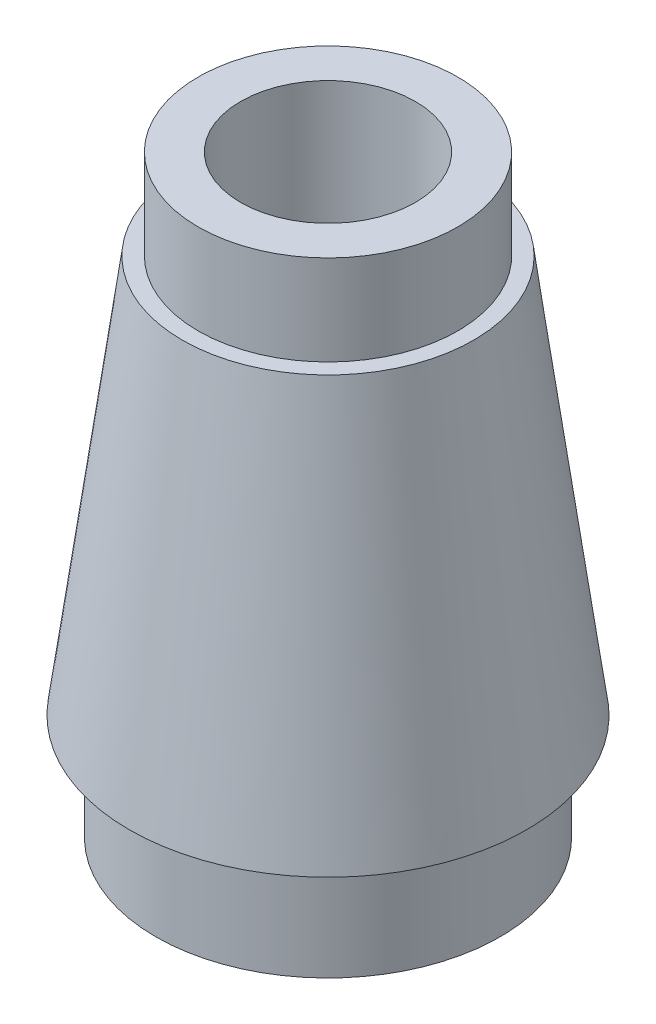
ISO-10303-21;
HEADER;
FILE_DESCRIPTION(('STEP AP214'),'2;1');
FILE_NAME('part.step','',(''),(''),'','','');
FILE_SCHEMA(('AUTOMOTIVE_DESIGN { 1 0 10303 214 1 1 1 1 }'));
ENDSEC;
DATA;
#1=APPLICATION_CONTEXT('core data for automotive mechanical design processes');
#2=APPLICATION_PROTOCOL_DEFINITION('international standard','automotive_design',2000,#1);
#3=PRODUCT_CONTEXT('',#1,'mechanical');
#4=PRODUCT('Part','Part','',(#3));
#5=PRODUCT_RELATED_PRODUCT_CATEGORY('part','',(#4));
#6=PRODUCT_DEFINITION_FORMATION('','',#4);
#7=PRODUCT_DEFINITION_CONTEXT('part definition',#1,'design');
#8=PRODUCT_DEFINITION('design','',#6,#7);
#9=PRODUCT_DEFINITION_SHAPE('','',#8);
#10=(LENGTH_UNIT() NAMED_UNIT(*) SI_UNIT(.MILLI.,.METRE.));
#11=(NAMED_UNIT(*) PLANE_ANGLE_UNIT() SI_UNIT($,.RADIAN.));
#12=(NAMED_UNIT(*) SI_UNIT($,.STERADIAN.) SOLID_ANGLE_UNIT());
#13=UNCERTAINTY_MEASURE_WITH_UNIT(LENGTH_MEASURE(1.E-05),#10,'distance_accuracy_value','');
#14=(GEOMETRIC_REPRESENTATION_CONTEXT(3) GLOBAL_UNCERTAINTY_ASSIGNED_CONTEXT((#13)) GLOBAL_UNIT_ASSIGNED_CONTEXT((#10,
#11,#12)) REPRESENTATION_CONTEXT('',''));
#15=CARTESIAN_POINT('',(0.,0.,0.));
#16=DIRECTION('',(0.,0.,1.));
#17=DIRECTION('',(1.,0.,0.));
#18=AXIS2_PLACEMENT_3D('',#15,#16,#17);
#19=CARTESIAN_POINT('',(0.,0.,0.));
#20=DIRECTION('',(0.,1.,0.));
#21=DIRECTION('',(0.,0.,1.));
#22=AXIS2_PLACEMENT_3D('',#19,#20,#21);
#23=PLANE('',#22);
#24=CARTESIAN_POINT('',(0.,0.,0.));
#25=DIRECTION('',(0.,1.,0.));
#26=DIRECTION('',(0.,0.,1.));
#27=AXIS2_PLACEMENT_3D('',#24,#25,#26);
#28=CIRCLE('',#27,3.25);
#29=CARTESIAN_POINT('',(0.,0.,3.25));
#30=VERTEX_POINT('',#29);
#31=EDGE_CURVE('E11',#30,#30,#28,.F.);
#32=ORIENTED_EDGE('',*,*,#31,.F.);
#33=EDGE_LOOP('',(#32));
#34=FACE_BOUND('',#33,.T.);
#35=CARTESIAN_POINT('',(0.,0.,0.));
#36=DIRECTION('',(0.,1.,0.));
#37=DIRECTION('',(0.,0.,1.));
#38=AXIS2_PLACEMENT_3D('',#35,#36,#37);
#39=CIRCLE('',#38,3.75);
#40=CARTESIAN_POINT('',(0.,0.,3.75));
#41=VERTEX_POINT('',#40);
#42=EDGE_CURVE('E46',#41,#41,#39,.T.);
#43=ORIENTED_EDGE('',*,*,#42,.F.);
#44=EDGE_LOOP('',(#43));
#45=FACE_BOUND('',#44,.T.);
#46=ADVANCED_FACE('F38',(#34,#45),#23,.F.);
#47=CARTESIAN_POINT('',(0.,7.5,0.));
#48=DIRECTION('',(0.,1.,0.));
#49=DIRECTION('',(0.,0.,1.));
#50=AXIS2_PLACEMENT_3D('',#47,#48,#49);
#51=PLANE('',#50);
#52=CARTESIAN_POINT('',(0.,7.5,0.));
#53=DIRECTION('',(0.,1.,0.));
#54=DIRECTION('',(0.,0.,1.));
#55=AXIS2_PLACEMENT_3D('',#52,#53,#54);
#56=CIRCLE('',#55,2.45);
#57=CARTESIAN_POINT('',(0.,7.5,2.45));
#58=VERTEX_POINT('',#57);
#59=EDGE_CURVE('E114',#58,#58,#56,.T.);
#60=ORIENTED_EDGE('',*,*,#59,.F.);
#61=EDGE_LOOP('',(#60));
#62=FACE_BOUND('',#61,.T.);
#63=CARTESIAN_POINT('',(0.,7.5,0.));
#64=DIRECTION('',(0.,1.,0.));
#65=DIRECTION('',(0.,0.,1.));
#66=AXIS2_PLACEMENT_3D('',#63,#64,#65);
#67=CIRCLE('',#66,2.75);
#68=CARTESIAN_POINT('',(0.,7.5,2.75));
#69=VERTEX_POINT('',#68);
#70=EDGE_CURVE('E50',#69,#69,#67,.T.);
#71=ORIENTED_EDGE('',*,*,#70,.T.);
#72=EDGE_LOOP('',(#71));
#73=FACE_BOUND('',#72,.T.);
#74=ADVANCED_FACE('F76',(#62,#73),#51,.T.);
#75=CARTESIAN_POINT('',(0.,7.5,0.));
#76=DIRECTION('',(0.,-1.,0.));
#77=DIRECTION('',(0.,0.,-1.));
#78=AXIS2_PLACEMENT_3D('',#75,#76,#77);
#79=CONICAL_SURFACE('',#78,2.75,0.132551532296675);
#80=ORIENTED_EDGE('',*,*,#70,.F.);
#81=EDGE_LOOP('',(#80));
#82=FACE_BOUND('',#81,.T.);
#83=ORIENTED_EDGE('',*,*,#42,.T.);
#84=EDGE_LOOP('',(#83));
#85=FACE_BOUND('',#84,.T.);
#86=ADVANCED_FACE('F85',(#82,#85),#79,.T.);
#87=CARTESIAN_POINT('',(0.,9.2,0.));
#88=DIRECTION('',(0.,1.,0.));
#89=DIRECTION('',(0.,0.,1.));
#90=AXIS2_PLACEMENT_3D('',#87,#88,#89);
#91=PLANE('',#90);
#92=CARTESIAN_POINT('',(0.,9.2,0.));
#93=DIRECTION('',(0.,1.,0.));
#94=DIRECTION('',(0.,0.,1.));
#95=AXIS2_PLACEMENT_3D('',#92,#93,#94);
#96=CIRCLE('',#95,2.45);
#97=CARTESIAN_POINT('',(0.,9.2,2.45));
#98=VERTEX_POINT('',#97);
#99=EDGE_CURVE('E70',#98,#98,#96,.T.);
#100=ORIENTED_EDGE('',*,*,#99,.T.);
#101=EDGE_LOOP('',(#100));
#102=FACE_BOUND('',#101,.T.);
#103=CARTESIAN_POINT('',(0.,9.2,0.));
#104=DIRECTION('',(0.,1.,0.));
#105=DIRECTION('',(0.,0.,1.));
#106=AXIS2_PLACEMENT_3D('',#103,#104,#105);
#107=CIRCLE('',#106,1.65);
#108=CARTESIAN_POINT('',(0.,9.2,1.65));
#109=VERTEX_POINT('',#108);
#110=EDGE_CURVE('E117',#109,#109,#107,.T.);
#111=ORIENTED_EDGE('',*,*,#110,.F.);
#112=EDGE_LOOP('',(#111));
#113=FACE_BOUND('',#112,.T.);
#114=ADVANCED_FACE('F91',(#102,#113),#91,.T.);
#115=CARTESIAN_POINT('',(0.,9.2,0.));
#116=DIRECTION('',(0.,-1.,0.));
#117=DIRECTION('',(0.,0.,-1.));
#118=AXIS2_PLACEMENT_3D('',#115,#116,#117);
#119=CYLINDRICAL_SURFACE('',#118,2.45);
#120=ORIENTED_EDGE('',*,*,#99,.F.);
#121=EDGE_LOOP('',(#120));
#122=FACE_BOUND('',#121,.T.);
#123=ORIENTED_EDGE('',*,*,#59,.T.);
#124=EDGE_LOOP('',(#123));
#125=FACE_BOUND('',#124,.T.);
#126=ADVANCED_FACE('F87',(#122,#125),#119,.T.);
#127=CARTESIAN_POINT('',(0.,9.2,0.));
#128=DIRECTION('',(0.,-1.,0.));
#129=DIRECTION('',(0.,0.,-1.));
#130=AXIS2_PLACEMENT_3D('',#127,#128,#129);
#131=CYLINDRICAL_SURFACE('',#130,1.65);
#132=ORIENTED_EDGE('',*,*,#110,.T.);
#133=EDGE_LOOP('',(#132));
#134=FACE_BOUND('',#133,.T.);
#135=CARTESIAN_POINT('',(0.,0.,0.));
#136=DIRECTION('',(0.,1.,0.));
#137=DIRECTION('',(0.,0.,1.));
#138=AXIS2_PLACEMENT_3D('',#135,#136,#137);
#139=CIRCLE('',#138,1.65);
#140=CARTESIAN_POINT('',(0.,0.,1.65));
#141=VERTEX_POINT('',#140);
#142=EDGE_CURVE('E42',#141,#141,#139,.T.);
#143=ORIENTED_EDGE('',*,*,#142,.F.);
#144=EDGE_LOOP('',(#143));
#145=FACE_BOUND('',#144,.T.);
#146=ADVANCED_FACE('F138',(#134,#145),#131,.F.);
#147=CARTESIAN_POINT('',(0.,-2.,0.));
#148=DIRECTION('',(0.,-1.,0.));
#149=DIRECTION('',(0.,0.,-1.));
#150=AXIS2_PLACEMENT_3D('',#147,#148,#149);
#151=PLANE('',#150);
#152=CARTESIAN_POINT('',(0.,-2.,0.));
#153=DIRECTION('',(0.,-1.,0.));
#154=DIRECTION('',(0.,0.,-1.));
#155=AXIS2_PLACEMENT_3D('',#152,#153,#154);
#156=CIRCLE('',#155,3.25);
#157=CARTESIAN_POINT('',(0.,-2.,-3.25));
#158=VERTEX_POINT('',#157);
#159=EDGE_CURVE('E122',#158,#158,#156,.T.);
#160=ORIENTED_EDGE('',*,*,#159,.T.);
#161=EDGE_LOOP('',(#160));
#162=FACE_BOUND('',#161,.T.);
#163=CARTESIAN_POINT('',(0.,-2.,0.));
#164=DIRECTION('',(0.,-1.,0.));
#165=DIRECTION('',(0.,0.,-1.));
#166=AXIS2_PLACEMENT_3D('',#163,#164,#165);
#167=CIRCLE('',#166,2.45);
#168=CARTESIAN_POINT('',(0.,-2.,-2.45));
#169=VERTEX_POINT('',#168);
#170=EDGE_CURVE('E125',#169,#169,#167,.T.);
#171=ORIENTED_EDGE('',*,*,#170,.F.);
#172=EDGE_LOOP('',(#171));
#173=FACE_BOUND('',#172,.T.);
#174=ADVANCED_FACE('F135',(#162,#173),#151,.T.);
#175=CARTESIAN_POINT('',(0.,-2.,0.));
#176=DIRECTION('',(0.,1.,0.));
#177=DIRECTION('',(0.,0.,1.));
#178=AXIS2_PLACEMENT_3D('',#175,#176,#177);
#179=CYLINDRICAL_SURFACE('',#178,3.25);
#180=ORIENTED_EDGE('',*,*,#159,.F.);
#181=EDGE_LOOP('',(#180));
#182=FACE_BOUND('',#181,.T.);
#183=ORIENTED_EDGE('',*,*,#31,.T.);
#184=EDGE_LOOP('',(#183));
#185=FACE_BOUND('',#184,.T.);
#186=ADVANCED_FACE('F137',(#182,#185),#179,.T.);
#187=CARTESIAN_POINT('',(0.,-2.,0.));
#188=DIRECTION('',(0.,1.,0.));
#189=DIRECTION('',(0.,0.,1.));
#190=AXIS2_PLACEMENT_3D('',#187,#188,#189);
#191=CYLINDRICAL_SURFACE('',#190,2.45);
#192=ORIENTED_EDGE('',*,*,#170,.T.);
#193=EDGE_LOOP('',(#192));
#194=FACE_BOUND('',#193,.T.);
#195=CARTESIAN_POINT('',(0.,0.,0.));
#196=DIRECTION('',(0.,-1.,0.));
#197=DIRECTION('',(0.,0.,-1.));
#198=AXIS2_PLACEMENT_3D('',#195,#196,#197);
#199=CIRCLE('',#198,2.45);
#200=CARTESIAN_POINT('',(0.,0.,-2.45));
#201=VERTEX_POINT('',#200);
#202=EDGE_CURVE('E126',#201,#201,#199,.T.);
#203=ORIENTED_EDGE('',*,*,#202,.F.);
#204=EDGE_LOOP('',(#203));
#205=FACE_BOUND('',#204,.T.);
#206=ADVANCED_FACE('F132',(#194,#205),#191,.F.);
#207=ORIENTED_EDGE('',*,*,#142,.T.);
#208=EDGE_LOOP('',(#207));
#209=FACE_BOUND('',#208,.T.);
#210=ORIENTED_EDGE('',*,*,#202,.T.);
#211=EDGE_LOOP('',(#210));
#212=FACE_BOUND('',#211,.T.);
#213=ADVANCED_FACE('F152',(#209,#212),#23,.F.);
#214=CLOSED_SHELL('',(#46,#74,#86,#114,#126,#146,#174,#186,#206,#213));
#215=MANIFOLD_SOLID_BREP('B2',#214);
#216=ADVANCED_BREP_SHAPE_REPRESENTATION('',(#18,#215),#14);
#217=SHAPE_DEFINITION_REPRESENTATION(#9,#216);
ENDSEC;
END-ISO-10303-21;
